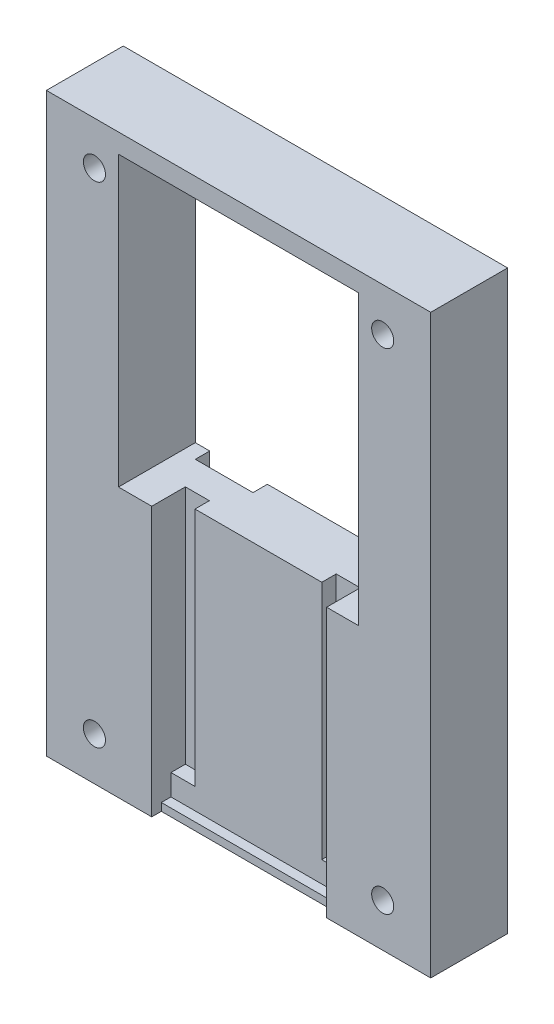
ISO-10303-21;
HEADER;
FILE_DESCRIPTION(('STEP AP214'),'2;1');
FILE_NAME('part.step','',(''),(''),'','','');
FILE_SCHEMA(('AUTOMOTIVE_DESIGN { 1 0 10303 214 1 1 1 1 }'));
ENDSEC;
DATA;
#1=APPLICATION_CONTEXT('core data for automotive mechanical design processes');
#2=APPLICATION_PROTOCOL_DEFINITION('international standard','automotive_design',2000,#1);
#3=PRODUCT_CONTEXT('',#1,'mechanical');
#4=PRODUCT('Part','Part','',(#3));
#5=PRODUCT_RELATED_PRODUCT_CATEGORY('part','',(#4));
#6=PRODUCT_DEFINITION_FORMATION('','',#4);
#7=PRODUCT_DEFINITION_CONTEXT('part definition',#1,'design');
#8=PRODUCT_DEFINITION('design','',#6,#7);
#9=PRODUCT_DEFINITION_SHAPE('','',#8);
#10=(LENGTH_UNIT() NAMED_UNIT(*) SI_UNIT(.MILLI.,.METRE.));
#11=(NAMED_UNIT(*) PLANE_ANGLE_UNIT() SI_UNIT($,.RADIAN.));
#12=(NAMED_UNIT(*) SI_UNIT($,.STERADIAN.) SOLID_ANGLE_UNIT());
#13=UNCERTAINTY_MEASURE_WITH_UNIT(LENGTH_MEASURE(1.E-05),#10,'distance_accuracy_value','');
#14=(GEOMETRIC_REPRESENTATION_CONTEXT(3) GLOBAL_UNCERTAINTY_ASSIGNED_CONTEXT((#13)) GLOBAL_UNIT_ASSIGNED_CONTEXT((#10,
#11,#12)) REPRESENTATION_CONTEXT('',''));
#15=CARTESIAN_POINT('',(0.,0.,0.));
#16=DIRECTION('',(0.,0.,1.));
#17=DIRECTION('',(1.,0.,0.));
#18=AXIS2_PLACEMENT_3D('',#15,#16,#17);
#19=CARTESIAN_POINT('',(0.,0.,0.));
#20=DIRECTION('',(0.,0.,1.));
#21=DIRECTION('',(1.,0.,0.));
#22=AXIS2_PLACEMENT_3D('',#19,#20,#21);
#23=PLANE('',#22);
#24=DIRECTION('',(1.,0.,0.));
#25=VECTOR('',#24,1.);
#26=CARTESIAN_POINT('',(26.,23.9,0.));
#27=LINE('',#26,#25);
#28=CARTESIAN_POINT('',(21.,23.9,0.));
#29=VERTEX_POINT('',#28);
#30=CARTESIAN_POINT('',(26.,23.9,0.));
#31=VERTEX_POINT('',#30);
#32=EDGE_CURVE('E251',#29,#31,#27,.T.);
#33=ORIENTED_EDGE('',*,*,#32,.F.);
#34=DIRECTION('',(0.,1.,0.));
#35=VECTOR('',#34,1.);
#36=CARTESIAN_POINT('',(21.,20.9,0.));
#37=LINE('',#36,#35);
#38=CARTESIAN_POINT('',(21.,20.9,0.));
#39=VERTEX_POINT('',#38);
#40=EDGE_CURVE('E53',#39,#29,#37,.T.);
#41=ORIENTED_EDGE('',*,*,#40,.F.);
#42=DIRECTION('',(-1.,0.,0.));
#43=VECTOR('',#42,1.);
#44=CARTESIAN_POINT('',(26.,20.9,0.));
#45=LINE('',#44,#43);
#46=CARTESIAN_POINT('',(26.,20.9,0.));
#47=VERTEX_POINT('',#46);
#48=EDGE_CURVE('E244',#47,#39,#45,.T.);
#49=ORIENTED_EDGE('',*,*,#48,.F.);
#50=DIRECTION('',(0.,-1.,0.));
#51=VECTOR('',#50,1.);
#52=CARTESIAN_POINT('',(26.,20.9,0.));
#53=LINE('',#52,#51);
#54=EDGE_CURVE('E247',#31,#47,#53,.T.);
#55=ORIENTED_EDGE('',*,*,#54,.F.);
#56=EDGE_LOOP('',(#33,#41,#49,#55));
#57=FACE_BOUND('',#56,.T.);
#58=DIRECTION('',(1.,0.,0.));
#59=VECTOR('',#58,1.);
#60=CARTESIAN_POINT('',(0.,0.,0.));
#61=LINE('',#60,#59);
#62=CARTESIAN_POINT('',(0.,0.,0.));
#63=VERTEX_POINT('',#62);
#64=CARTESIAN_POINT('',(40.,0.,0.));
#65=VERTEX_POINT('',#64);
#66=EDGE_CURVE('E419',#63,#65,#61,.T.);
#67=ORIENTED_EDGE('',*,*,#66,.F.);
#68=DIRECTION('',(0.,-1.,0.));
#69=VECTOR('',#68,1.);
#70=CARTESIAN_POINT('',(0.,0.,0.));
#71=LINE('',#70,#69);
#72=CARTESIAN_POINT('',(0.,60.,0.));
#73=VERTEX_POINT('',#72);
#74=EDGE_CURVE('E437',#73,#63,#71,.T.);
#75=ORIENTED_EDGE('',*,*,#74,.F.);
#76=DIRECTION('',(-1.,0.,0.));
#77=VECTOR('',#76,1.);
#78=CARTESIAN_POINT('',(0.,60.,0.));
#79=LINE('',#78,#77);
#80=CARTESIAN_POINT('',(40.,60.,0.));
#81=VERTEX_POINT('',#80);
#82=EDGE_CURVE('E440',#81,#73,#79,.T.);
#83=ORIENTED_EDGE('',*,*,#82,.F.);
#84=DIRECTION('',(0.,1.,0.));
#85=VECTOR('',#84,1.);
#86=CARTESIAN_POINT('',(40.,0.,0.));
#87=LINE('',#86,#85);
#88=EDGE_CURVE('E434',#65,#81,#87,.T.);
#89=ORIENTED_EDGE('',*,*,#88,.F.);
#90=EDGE_LOOP('',(#67,#75,#83,#89));
#91=FACE_BOUND('',#90,.T.);
#92=CARTESIAN_POINT('',(5.00000000000001,4.5,0.));
#93=DIRECTION('',(0.,0.,1.));
#94=DIRECTION('',(1.,0.,0.));
#95=AXIS2_PLACEMENT_3D('',#92,#93,#94);
#96=CIRCLE('',#95,1.15);
#97=CARTESIAN_POINT('',(6.15000000000001,4.5,0.));
#98=VERTEX_POINT('',#97);
#99=EDGE_CURVE('E417',#98,#98,#96,.T.);
#100=ORIENTED_EDGE('',*,*,#99,.T.);
#101=EDGE_LOOP('',(#100));
#102=FACE_BOUND('',#101,.T.);
#103=CARTESIAN_POINT('',(35.,55.5,0.));
#104=DIRECTION('',(0.,0.,1.));
#105=DIRECTION('',(1.,0.,0.));
#106=AXIS2_PLACEMENT_3D('',#103,#104,#105);
#107=CIRCLE('',#106,1.15);
#108=CARTESIAN_POINT('',(36.15,55.5,0.));
#109=VERTEX_POINT('',#108);
#110=EDGE_CURVE('E388',#109,#109,#107,.T.);
#111=ORIENTED_EDGE('',*,*,#110,.T.);
#112=EDGE_LOOP('',(#111));
#113=FACE_BOUND('',#112,.T.);
#114=CARTESIAN_POINT('',(5.00000000000001,55.5,0.));
#115=DIRECTION('',(0.,0.,1.));
#116=DIRECTION('',(1.,0.,0.));
#117=AXIS2_PLACEMENT_3D('',#114,#115,#116);
#118=CIRCLE('',#117,1.15);
#119=CARTESIAN_POINT('',(6.15000000000001,55.5,0.));
#120=VERTEX_POINT('',#119);
#121=EDGE_CURVE('E402',#120,#120,#118,.T.);
#122=ORIENTED_EDGE('',*,*,#121,.T.);
#123=EDGE_LOOP('',(#122));
#124=FACE_BOUND('',#123,.T.);
#125=CARTESIAN_POINT('',(35.,4.5,0.));
#126=DIRECTION('',(0.,0.,1.));
#127=DIRECTION('',(1.,0.,0.));
#128=AXIS2_PLACEMENT_3D('',#125,#126,#127);
#129=CIRCLE('',#128,1.15);
#130=CARTESIAN_POINT('',(36.15,4.5,0.));
#131=VERTEX_POINT('',#130);
#132=EDGE_CURVE('E409',#131,#131,#129,.T.);
#133=ORIENTED_EDGE('',*,*,#132,.T.);
#134=EDGE_LOOP('',(#133));
#135=FACE_BOUND('',#134,.T.);
#136=DIRECTION('',(0.,1.,0.));
#137=VECTOR('',#136,1.);
#138=CARTESIAN_POINT('',(9.,34.,0.));
#139=LINE('',#138,#137);
#140=CARTESIAN_POINT('',(9.,23.,0.));
#141=VERTEX_POINT('',#140);
#142=CARTESIAN_POINT('',(9.,28.,0.));
#143=VERTEX_POINT('',#142);
#144=EDGE_CURVE('E253',#141,#143,#139,.T.);
#145=ORIENTED_EDGE('',*,*,#144,.F.);
#146=DIRECTION('',(-1.,0.,0.));
#147=VECTOR('',#146,1.);
#148=CARTESIAN_POINT('',(9.,23.,0.));
#149=LINE('',#148,#147);
#150=CARTESIAN_POINT('',(15.,23.,0.));
#151=VERTEX_POINT('',#150);
#152=EDGE_CURVE('E272',#151,#141,#149,.T.);
#153=ORIENTED_EDGE('',*,*,#152,.F.);
#154=DIRECTION('',(0.,-1.,0.));
#155=VECTOR('',#154,1.);
#156=CARTESIAN_POINT('',(15.,34.,0.));
#157=LINE('',#156,#155);
#158=CARTESIAN_POINT('',(15.,28.,0.));
#159=VERTEX_POINT('',#158);
#160=EDGE_CURVE('E274',#159,#151,#157,.T.);
#161=ORIENTED_EDGE('',*,*,#160,.F.);
#162=DIRECTION('',(1.,0.,0.));
#163=VECTOR('',#162,1.);
#164=CARTESIAN_POINT('',(7.5,28.,0.));
#165=LINE('',#164,#163);
#166=CARTESIAN_POINT('',(32.5,28.,0.));
#167=VERTEX_POINT('',#166);
#168=EDGE_CURVE('E366',#159,#167,#165,.T.);
#169=ORIENTED_EDGE('',*,*,#168,.T.);
#170=DIRECTION('',(0.,1.,0.));
#171=VECTOR('',#170,1.);
#172=CARTESIAN_POINT('',(32.5,58.,0.));
#173=LINE('',#172,#171);
#174=CARTESIAN_POINT('',(32.5,58.,0.));
#175=VERTEX_POINT('',#174);
#176=EDGE_CURVE('E371',#167,#175,#173,.T.);
#177=ORIENTED_EDGE('',*,*,#176,.T.);
#178=DIRECTION('',(-1.,0.,0.));
#179=VECTOR('',#178,1.);
#180=CARTESIAN_POINT('',(7.5,58.,0.));
#181=LINE('',#180,#179);
#182=CARTESIAN_POINT('',(7.5,58.,0.));
#183=VERTEX_POINT('',#182);
#184=EDGE_CURVE('E372',#175,#183,#181,.T.);
#185=ORIENTED_EDGE('',*,*,#184,.T.);
#186=DIRECTION('',(0.,-1.,0.));
#187=VECTOR('',#186,1.);
#188=CARTESIAN_POINT('',(7.5,58.,0.));
#189=LINE('',#188,#187);
#190=CARTESIAN_POINT('',(7.5,28.,0.));
#191=VERTEX_POINT('',#190);
#192=EDGE_CURVE('E361',#183,#191,#189,.T.);
#193=ORIENTED_EDGE('',*,*,#192,.T.);
#194=EDGE_CURVE('E368',#191,#143,#165,.T.);
#195=ORIENTED_EDGE('',*,*,#194,.T.);
#196=EDGE_LOOP('',(#145,#153,#161,#169,#177,#185,#193,#195));
#197=FACE_BOUND('',#196,.T.);
#198=ADVANCED_FACE('F39',(#57,#91,#102,#113,#124,#135,#197),#23,.F.);
#199=CARTESIAN_POINT('',(0.,0.,6.));
#200=DIRECTION('',(0.,0.,-1.));
#201=DIRECTION('',(-1.,0.,0.));
#202=AXIS2_PLACEMENT_3D('',#199,#200,#201);
#203=PLANE('',#202);
#204=DIRECTION('',(-1.,0.,0.));
#205=VECTOR('',#204,1.);
#206=CARTESIAN_POINT('',(10.9625098567106,0.8,6.));
#207=LINE('',#206,#205);
#208=CARTESIAN_POINT('',(29.1625098567106,0.8,6.));
#209=VERTEX_POINT('',#208);
#210=CARTESIAN_POINT('',(10.9625098567106,0.8,6.));
#211=VERTEX_POINT('',#210);
#212=EDGE_CURVE('E262',#209,#211,#207,.T.);
#213=ORIENTED_EDGE('',*,*,#212,.F.);
#214=DIRECTION('',(0.,1.,0.));
#215=VECTOR('',#214,1.);
#216=CARTESIAN_POINT('',(29.1625098567106,0.,6.));
#217=LINE('',#216,#215);
#218=CARTESIAN_POINT('',(29.1625098567106,3.,6.));
#219=VERTEX_POINT('',#218);
#220=EDGE_CURVE('E355',#209,#219,#217,.T.);
#221=ORIENTED_EDGE('',*,*,#220,.T.);
#222=DIRECTION('',(1.,0.,0.));
#223=VECTOR('',#222,1.);
#224=CARTESIAN_POINT('',(29.1625098567106,3.,6.));
#225=LINE('',#224,#223);
#226=CARTESIAN_POINT('',(26.6625098567106,3.,6.));
#227=VERTEX_POINT('',#226);
#228=EDGE_CURVE('E333',#227,#219,#225,.T.);
#229=ORIENTED_EDGE('',*,*,#228,.F.);
#230=DIRECTION('',(0.,-1.,0.));
#231=VECTOR('',#230,1.);
#232=CARTESIAN_POINT('',(26.6625098567106,28.,6.));
#233=LINE('',#232,#231);
#234=CARTESIAN_POINT('',(26.6625098567106,28.,6.));
#235=VERTEX_POINT('',#234);
#236=EDGE_CURVE('E320',#235,#227,#233,.T.);
#237=ORIENTED_EDGE('',*,*,#236,.F.);
#238=DIRECTION('',(1.,0.,0.));
#239=VECTOR('',#238,1.);
#240=CARTESIAN_POINT('',(7.5,28.,6.));
#241=LINE('',#240,#239);
#242=CARTESIAN_POINT('',(13.4625098567106,28.,6.));
#243=VERTEX_POINT('',#242);
#244=EDGE_CURVE('E455',#243,#235,#241,.T.);
#245=ORIENTED_EDGE('',*,*,#244,.F.);
#246=DIRECTION('',(0.,1.,0.));
#247=VECTOR('',#246,1.);
#248=CARTESIAN_POINT('',(13.4625098567106,28.,6.));
#249=LINE('',#248,#247);
#250=CARTESIAN_POINT('',(13.4625098567106,3.,6.));
#251=VERTEX_POINT('',#250);
#252=EDGE_CURVE('E304',#251,#243,#249,.T.);
#253=ORIENTED_EDGE('',*,*,#252,.F.);
#254=DIRECTION('',(1.,0.,0.));
#255=VECTOR('',#254,1.);
#256=CARTESIAN_POINT('',(10.9625098567106,3.,6.));
#257=LINE('',#256,#255);
#258=CARTESIAN_POINT('',(10.9625098567106,3.,6.));
#259=VERTEX_POINT('',#258);
#260=EDGE_CURVE('E313',#259,#251,#257,.T.);
#261=ORIENTED_EDGE('',*,*,#260,.F.);
#262=DIRECTION('',(0.,-1.,0.));
#263=VECTOR('',#262,1.);
#264=CARTESIAN_POINT('',(10.9625098567106,0.,6.));
#265=LINE('',#264,#263);
#266=EDGE_CURVE('E346',#259,#211,#265,.T.);
#267=ORIENTED_EDGE('',*,*,#266,.T.);
#268=EDGE_LOOP('',(#213,#221,#229,#237,#245,#253,#261,#267));
#269=FACE_BOUND('',#268,.T.);
#270=ADVANCED_FACE('F493',(#269),#203,.F.);
#271=CARTESIAN_POINT('',(10.9625098567106,0.,6.));
#272=DIRECTION('',(-1.,0.,0.));
#273=DIRECTION('',(0.,0.,1.));
#274=AXIS2_PLACEMENT_3D('',#271,#272,#273);
#275=PLANE('',#274);
#276=DIRECTION('',(0.,-1.,0.));
#277=VECTOR('',#276,1.);
#278=CARTESIAN_POINT('',(10.9625098567106,0.,7.));
#279=LINE('',#278,#277);
#280=CARTESIAN_POINT('',(10.9625098567106,0.8,7.));
#281=VERTEX_POINT('',#280);
#282=CARTESIAN_POINT('',(10.9625098567106,0.,7.));
#283=VERTEX_POINT('',#282);
#284=EDGE_CURVE('E282',#281,#283,#279,.T.);
#285=ORIENTED_EDGE('',*,*,#284,.F.);
#286=DIRECTION('',(0.,0.,-1.));
#287=VECTOR('',#286,1.);
#288=CARTESIAN_POINT('',(10.9625098567106,0.8,7.));
#289=LINE('',#288,#287);
#290=EDGE_CURVE('E291',#281,#211,#289,.T.);
#291=ORIENTED_EDGE('',*,*,#290,.T.);
#292=ORIENTED_EDGE('',*,*,#266,.F.);
#293=DIRECTION('',(0.,0.,1.));
#294=VECTOR('',#293,1.);
#295=CARTESIAN_POINT('',(10.9625098567106,3.,4.5));
#296=LINE('',#295,#294);
#297=CARTESIAN_POINT('',(10.9625098567106,3.,4.5));
#298=VERTEX_POINT('',#297);
#299=EDGE_CURVE('E312',#298,#259,#296,.T.);
#300=ORIENTED_EDGE('',*,*,#299,.F.);
#301=DIRECTION('',(0.,-1.,0.));
#302=VECTOR('',#301,1.);
#303=CARTESIAN_POINT('',(10.9625098567106,28.,4.5));
#304=LINE('',#303,#302);
#305=CARTESIAN_POINT('',(10.9625098567106,28.,4.5));
#306=VERTEX_POINT('',#305);
#307=EDGE_CURVE('E301',#306,#298,#304,.T.);
#308=ORIENTED_EDGE('',*,*,#307,.F.);
#309=DIRECTION('',(0.,0.,-1.));
#310=VECTOR('',#309,1.);
#311=CARTESIAN_POINT('',(10.9625098567106,28.,0.));
#312=LINE('',#311,#310);
#313=CARTESIAN_POINT('',(10.9625098567106,28.,8.));
#314=VERTEX_POINT('',#313);
#315=EDGE_CURVE('E460',#314,#306,#312,.T.);
#316=ORIENTED_EDGE('',*,*,#315,.F.);
#317=DIRECTION('',(0.,-1.,0.));
#318=VECTOR('',#317,1.);
#319=CARTESIAN_POINT('',(10.9625098567106,0.,8.));
#320=LINE('',#319,#318);
#321=CARTESIAN_POINT('',(10.9625098567106,0.,8.));
#322=VERTEX_POINT('',#321);
#323=EDGE_CURVE('E325',#314,#322,#320,.T.);
#324=ORIENTED_EDGE('',*,*,#323,.T.);
#325=DIRECTION('',(0.,0.,1.));
#326=VECTOR('',#325,1.);
#327=CARTESIAN_POINT('',(10.9625098567106,0.,6.));
#328=LINE('',#327,#326);
#329=EDGE_CURVE('E351',#283,#322,#328,.T.);
#330=ORIENTED_EDGE('',*,*,#329,.F.);
#331=EDGE_LOOP('',(#285,#291,#292,#300,#308,#316,#324,#330));
#332=FACE_BOUND('',#331,.T.);
#333=ADVANCED_FACE('F497',(#332),#275,.F.);
#334=CARTESIAN_POINT('',(29.1625098567106,0.,6.));
#335=DIRECTION('',(1.,0.,0.));
#336=DIRECTION('',(0.,0.,-1.));
#337=AXIS2_PLACEMENT_3D('',#334,#335,#336);
#338=PLANE('',#337);
#339=DIRECTION('',(0.,0.,-1.));
#340=VECTOR('',#339,1.);
#341=CARTESIAN_POINT('',(29.1625098567106,0.8,7.));
#342=LINE('',#341,#340);
#343=CARTESIAN_POINT('',(29.1625098567106,0.8,7.));
#344=VERTEX_POINT('',#343);
#345=EDGE_CURVE('E300',#344,#209,#342,.T.);
#346=ORIENTED_EDGE('',*,*,#345,.F.);
#347=DIRECTION('',(0.,1.,0.));
#348=VECTOR('',#347,1.);
#349=CARTESIAN_POINT('',(29.1625098567106,0.,7.));
#350=LINE('',#349,#348);
#351=CARTESIAN_POINT('',(29.1625098567106,0.,7.));
#352=VERTEX_POINT('',#351);
#353=EDGE_CURVE('E290',#352,#344,#350,.T.);
#354=ORIENTED_EDGE('',*,*,#353,.F.);
#355=DIRECTION('',(0.,0.,1.));
#356=VECTOR('',#355,1.);
#357=CARTESIAN_POINT('',(29.1625098567106,0.,6.));
#358=LINE('',#357,#356);
#359=CARTESIAN_POINT('',(29.1625098567106,0.,8.));
#360=VERTEX_POINT('',#359);
#361=EDGE_CURVE('E360',#352,#360,#358,.T.);
#362=ORIENTED_EDGE('',*,*,#361,.T.);
#363=DIRECTION('',(0.,1.,0.));
#364=VECTOR('',#363,1.);
#365=CARTESIAN_POINT('',(29.1625098567106,0.,8.));
#366=LINE('',#365,#364);
#367=CARTESIAN_POINT('',(29.1625098567106,28.,8.));
#368=VERTEX_POINT('',#367);
#369=EDGE_CURVE('E353',#360,#368,#366,.T.);
#370=ORIENTED_EDGE('',*,*,#369,.T.);
#371=DIRECTION('',(0.,0.,1.));
#372=VECTOR('',#371,1.);
#373=CARTESIAN_POINT('',(29.1625098567106,28.,0.));
#374=LINE('',#373,#372);
#375=CARTESIAN_POINT('',(29.1625098567106,28.,4.5));
#376=VERTEX_POINT('',#375);
#377=EDGE_CURVE('E453',#376,#368,#374,.T.);
#378=ORIENTED_EDGE('',*,*,#377,.F.);
#379=DIRECTION('',(0.,1.,0.));
#380=VECTOR('',#379,1.);
#381=CARTESIAN_POINT('',(29.1625098567106,28.,4.5));
#382=LINE('',#381,#380);
#383=CARTESIAN_POINT('',(29.1625098567106,3.,4.5));
#384=VERTEX_POINT('',#383);
#385=EDGE_CURVE('E337',#384,#376,#382,.T.);
#386=ORIENTED_EDGE('',*,*,#385,.F.);
#387=DIRECTION('',(0.,0.,1.));
#388=VECTOR('',#387,1.);
#389=CARTESIAN_POINT('',(29.1625098567106,3.,4.5));
#390=LINE('',#389,#388);
#391=EDGE_CURVE('E297',#384,#219,#390,.T.);
#392=ORIENTED_EDGE('',*,*,#391,.T.);
#393=ORIENTED_EDGE('',*,*,#220,.F.);
#394=EDGE_LOOP('',(#346,#354,#362,#370,#378,#386,#392,#393));
#395=FACE_BOUND('',#394,.T.);
#396=ADVANCED_FACE('F518',(#395),#338,.F.);
#397=CARTESIAN_POINT('',(0.,0.,8.));
#398=DIRECTION('',(0.,1.,0.));
#399=DIRECTION('',(-1.,0.,0.));
#400=AXIS2_PLACEMENT_3D('',#397,#398,#399);
#401=PLANE('',#400);
#402=DIRECTION('',(1.,0.,0.));
#403=VECTOR('',#402,1.);
#404=CARTESIAN_POINT('',(10.9625098567106,0.,7.));
#405=LINE('',#404,#403);
#406=EDGE_CURVE('E281',#283,#352,#405,.T.);
#407=ORIENTED_EDGE('',*,*,#406,.F.);
#408=ORIENTED_EDGE('',*,*,#329,.T.);
#409=DIRECTION('',(1.,0.,0.));
#410=VECTOR('',#409,1.);
#411=CARTESIAN_POINT('',(0.,0.,8.));
#412=LINE('',#411,#410);
#413=CARTESIAN_POINT('',(0.,0.,8.));
#414=VERTEX_POINT('',#413);
#415=EDGE_CURVE('E422',#414,#322,#412,.T.);
#416=ORIENTED_EDGE('',*,*,#415,.F.);
#417=DIRECTION('',(0.,0.,-1.));
#418=VECTOR('',#417,1.);
#419=CARTESIAN_POINT('',(0.,0.,8.));
#420=LINE('',#419,#418);
#421=EDGE_CURVE('E435',#414,#63,#420,.T.);
#422=ORIENTED_EDGE('',*,*,#421,.T.);
#423=ORIENTED_EDGE('',*,*,#66,.T.);
#424=DIRECTION('',(0.,0.,-1.));
#425=VECTOR('',#424,1.);
#426=CARTESIAN_POINT('',(40.,0.,8.));
#427=LINE('',#426,#425);
#428=CARTESIAN_POINT('',(40.,0.,8.));
#429=VERTEX_POINT('',#428);
#430=EDGE_CURVE('E446',#429,#65,#427,.T.);
#431=ORIENTED_EDGE('',*,*,#430,.F.);
#432=EDGE_CURVE('E428',#360,#429,#412,.T.);
#433=ORIENTED_EDGE('',*,*,#432,.F.);
#434=ORIENTED_EDGE('',*,*,#361,.F.);
#435=EDGE_LOOP('',(#407,#408,#416,#422,#423,#431,#433,#434));
#436=FACE_BOUND('',#435,.T.);
#437=ADVANCED_FACE('F41',(#436),#401,.F.);
#438=CARTESIAN_POINT('',(40.,0.,8.));
#439=DIRECTION('',(-1.,0.,0.));
#440=DIRECTION('',(0.,0.,1.));
#441=AXIS2_PLACEMENT_3D('',#438,#439,#440);
#442=PLANE('',#441);
#443=ORIENTED_EDGE('',*,*,#88,.T.);
#444=DIRECTION('',(0.,0.,-1.));
#445=VECTOR('',#444,1.);
#446=CARTESIAN_POINT('',(40.,60.,8.));
#447=LINE('',#446,#445);
#448=CARTESIAN_POINT('',(40.,60.,8.));
#449=VERTEX_POINT('',#448);
#450=EDGE_CURVE('E447',#449,#81,#447,.T.);
#451=ORIENTED_EDGE('',*,*,#450,.F.);
#452=DIRECTION('',(0.,1.,0.));
#453=VECTOR('',#452,1.);
#454=CARTESIAN_POINT('',(40.,0.,8.));
#455=LINE('',#454,#453);
#456=EDGE_CURVE('E424',#429,#449,#455,.T.);
#457=ORIENTED_EDGE('',*,*,#456,.F.);
#458=ORIENTED_EDGE('',*,*,#430,.T.);
#459=EDGE_LOOP('',(#443,#451,#457,#458));
#460=FACE_BOUND('',#459,.T.);
#461=ADVANCED_FACE('F514',(#460),#442,.F.);
#462=CARTESIAN_POINT('',(0.,60.,8.));
#463=DIRECTION('',(0.,-1.,0.));
#464=DIRECTION('',(1.,0.,0.));
#465=AXIS2_PLACEMENT_3D('',#462,#463,#464);
#466=PLANE('',#465);
#467=ORIENTED_EDGE('',*,*,#82,.T.);
#468=DIRECTION('',(0.,0.,-1.));
#469=VECTOR('',#468,1.);
#470=CARTESIAN_POINT('',(0.,60.,8.));
#471=LINE('',#470,#469);
#472=CARTESIAN_POINT('',(0.,60.,8.));
#473=VERTEX_POINT('',#472);
#474=EDGE_CURVE('E442',#473,#73,#471,.T.);
#475=ORIENTED_EDGE('',*,*,#474,.F.);
#476=DIRECTION('',(-1.,0.,0.));
#477=VECTOR('',#476,1.);
#478=CARTESIAN_POINT('',(0.,60.,8.));
#479=LINE('',#478,#477);
#480=EDGE_CURVE('E426',#449,#473,#479,.T.);
#481=ORIENTED_EDGE('',*,*,#480,.F.);
#482=ORIENTED_EDGE('',*,*,#450,.T.);
#483=EDGE_LOOP('',(#467,#475,#481,#482));
#484=FACE_BOUND('',#483,.T.);
#485=ADVANCED_FACE('F509',(#484),#466,.F.);
#486=CARTESIAN_POINT('',(0.,0.,8.));
#487=DIRECTION('',(1.,0.,0.));
#488=DIRECTION('',(0.,0.,-1.));
#489=AXIS2_PLACEMENT_3D('',#486,#487,#488);
#490=PLANE('',#489);
#491=ORIENTED_EDGE('',*,*,#74,.T.);
#492=ORIENTED_EDGE('',*,*,#421,.F.);
#493=DIRECTION('',(0.,-1.,0.));
#494=VECTOR('',#493,1.);
#495=CARTESIAN_POINT('',(0.,0.,8.));
#496=LINE('',#495,#494);
#497=EDGE_CURVE('E427',#473,#414,#496,.T.);
#498=ORIENTED_EDGE('',*,*,#497,.F.);
#499=ORIENTED_EDGE('',*,*,#474,.T.);
#500=EDGE_LOOP('',(#491,#492,#498,#499));
#501=FACE_BOUND('',#500,.T.);
#502=ADVANCED_FACE('F510',(#501),#490,.F.);
#503=CARTESIAN_POINT('',(0.,0.,8.));
#504=DIRECTION('',(0.,0.,1.));
#505=DIRECTION('',(1.,0.,0.));
#506=AXIS2_PLACEMENT_3D('',#503,#504,#505);
#507=PLANE('',#506);
#508=ORIENTED_EDGE('',*,*,#323,.F.);
#509=DIRECTION('',(1.,0.,0.));
#510=VECTOR('',#509,1.);
#511=CARTESIAN_POINT('',(7.5,28.,8.));
#512=LINE('',#511,#510);
#513=CARTESIAN_POINT('',(7.5,28.,8.));
#514=VERTEX_POINT('',#513);
#515=EDGE_CURVE('E379',#514,#314,#512,.T.);
#516=ORIENTED_EDGE('',*,*,#515,.F.);
#517=DIRECTION('',(0.,-1.,0.));
#518=VECTOR('',#517,1.);
#519=CARTESIAN_POINT('',(7.5,58.,8.));
#520=LINE('',#519,#518);
#521=CARTESIAN_POINT('',(7.5,58.,8.));
#522=VERTEX_POINT('',#521);
#523=EDGE_CURVE('E363',#522,#514,#520,.T.);
#524=ORIENTED_EDGE('',*,*,#523,.F.);
#525=DIRECTION('',(-1.,0.,0.));
#526=VECTOR('',#525,1.);
#527=CARTESIAN_POINT('',(7.5,58.,8.));
#528=LINE('',#527,#526);
#529=CARTESIAN_POINT('',(32.5,58.,8.));
#530=VERTEX_POINT('',#529);
#531=EDGE_CURVE('E370',#530,#522,#528,.T.);
#532=ORIENTED_EDGE('',*,*,#531,.F.);
#533=DIRECTION('',(0.,1.,0.));
#534=VECTOR('',#533,1.);
#535=CARTESIAN_POINT('',(32.5,58.,8.));
#536=LINE('',#535,#534);
#537=CARTESIAN_POINT('',(32.5,28.,8.));
#538=VERTEX_POINT('',#537);
#539=EDGE_CURVE('E384',#538,#530,#536,.T.);
#540=ORIENTED_EDGE('',*,*,#539,.F.);
#541=EDGE_CURVE('E378',#368,#538,#512,.T.);
#542=ORIENTED_EDGE('',*,*,#541,.F.);
#543=ORIENTED_EDGE('',*,*,#369,.F.);
#544=ORIENTED_EDGE('',*,*,#432,.T.);
#545=ORIENTED_EDGE('',*,*,#456,.T.);
#546=ORIENTED_EDGE('',*,*,#480,.T.);
#547=ORIENTED_EDGE('',*,*,#497,.T.);
#548=ORIENTED_EDGE('',*,*,#415,.T.);
#549=EDGE_LOOP('',(#508,#516,#524,#532,#540,#542,#543,#544,#545,#546,#547,#548));
#550=FACE_BOUND('',#549,.T.);
#551=CARTESIAN_POINT('',(35.,4.5,8.));
#552=DIRECTION('',(0.,0.,1.));
#553=DIRECTION('',(1.,0.,0.));
#554=AXIS2_PLACEMENT_3D('',#551,#552,#553);
#555=CIRCLE('',#554,1.15);
#556=CARTESIAN_POINT('',(36.15,4.5,8.));
#557=VERTEX_POINT('',#556);
#558=EDGE_CURVE('E404',#557,#557,#555,.T.);
#559=ORIENTED_EDGE('',*,*,#558,.F.);
#560=EDGE_LOOP('',(#559));
#561=FACE_BOUND('',#560,.T.);
#562=CARTESIAN_POINT('',(5.00000000000001,55.5,8.));
#563=DIRECTION('',(0.,0.,1.));
#564=DIRECTION('',(1.,0.,0.));
#565=AXIS2_PLACEMENT_3D('',#562,#563,#564);
#566=CIRCLE('',#565,1.15);
#567=CARTESIAN_POINT('',(6.15000000000001,55.5,8.));
#568=VERTEX_POINT('',#567);
#569=EDGE_CURVE('E412',#568,#568,#566,.T.);
#570=ORIENTED_EDGE('',*,*,#569,.F.);
#571=EDGE_LOOP('',(#570));
#572=FACE_BOUND('',#571,.T.);
#573=CARTESIAN_POINT('',(35.,55.5,8.));
#574=DIRECTION('',(0.,0.,1.));
#575=DIRECTION('',(1.,0.,0.));
#576=AXIS2_PLACEMENT_3D('',#573,#574,#575);
#577=CIRCLE('',#576,1.15);
#578=CARTESIAN_POINT('',(36.15,55.5,8.));
#579=VERTEX_POINT('',#578);
#580=EDGE_CURVE('E398',#579,#579,#577,.T.);
#581=ORIENTED_EDGE('',*,*,#580,.F.);
#582=EDGE_LOOP('',(#581));
#583=FACE_BOUND('',#582,.T.);
#584=CARTESIAN_POINT('',(5.00000000000001,4.5,8.));
#585=DIRECTION('',(0.,0.,1.));
#586=DIRECTION('',(1.,0.,0.));
#587=AXIS2_PLACEMENT_3D('',#584,#585,#586);
#588=CIRCLE('',#587,1.15);
#589=CARTESIAN_POINT('',(6.15000000000001,4.5,8.));
#590=VERTEX_POINT('',#589);
#591=EDGE_CURVE('E410',#590,#590,#588,.T.);
#592=ORIENTED_EDGE('',*,*,#591,.F.);
#593=EDGE_LOOP('',(#592));
#594=FACE_BOUND('',#593,.T.);
#595=ADVANCED_FACE('F504',(#550,#561,#572,#583,#594),#507,.T.);
#596=CARTESIAN_POINT('',(5.00000000000001,4.5,0.));
#597=DIRECTION('',(0.,0.,1.));
#598=DIRECTION('',(1.,0.,0.));
#599=AXIS2_PLACEMENT_3D('',#596,#597,#598);
#600=CYLINDRICAL_SURFACE('',#599,1.15);
#601=ORIENTED_EDGE('',*,*,#99,.F.);
#602=EDGE_LOOP('',(#601));
#603=FACE_BOUND('',#602,.T.);
#604=ORIENTED_EDGE('',*,*,#591,.T.);
#605=EDGE_LOOP('',(#604));
#606=FACE_BOUND('',#605,.T.);
#607=ADVANCED_FACE('F616',(#603,#606),#600,.F.);
#608=CARTESIAN_POINT('',(35.,55.5,0.));
#609=DIRECTION('',(0.,0.,1.));
#610=DIRECTION('',(1.,0.,0.));
#611=AXIS2_PLACEMENT_3D('',#608,#609,#610);
#612=CYLINDRICAL_SURFACE('',#611,1.15);
#613=ORIENTED_EDGE('',*,*,#110,.F.);
#614=EDGE_LOOP('',(#613));
#615=FACE_BOUND('',#614,.T.);
#616=ORIENTED_EDGE('',*,*,#580,.T.);
#617=EDGE_LOOP('',(#616));
#618=FACE_BOUND('',#617,.T.);
#619=ADVANCED_FACE('F614',(#615,#618),#612,.F.);
#620=CARTESIAN_POINT('',(5.00000000000001,55.5,0.));
#621=DIRECTION('',(0.,0.,1.));
#622=DIRECTION('',(1.,0.,0.));
#623=AXIS2_PLACEMENT_3D('',#620,#621,#622);
#624=CYLINDRICAL_SURFACE('',#623,1.15);
#625=ORIENTED_EDGE('',*,*,#121,.F.);
#626=EDGE_LOOP('',(#625));
#627=FACE_BOUND('',#626,.T.);
#628=ORIENTED_EDGE('',*,*,#569,.T.);
#629=EDGE_LOOP('',(#628));
#630=FACE_BOUND('',#629,.T.);
#631=ADVANCED_FACE('F617',(#627,#630),#624,.F.);
#632=CARTESIAN_POINT('',(35.,4.5,0.));
#633=DIRECTION('',(0.,0.,1.));
#634=DIRECTION('',(1.,0.,0.));
#635=AXIS2_PLACEMENT_3D('',#632,#633,#634);
#636=CYLINDRICAL_SURFACE('',#635,1.15);
#637=ORIENTED_EDGE('',*,*,#132,.F.);
#638=EDGE_LOOP('',(#637));
#639=FACE_BOUND('',#638,.T.);
#640=ORIENTED_EDGE('',*,*,#558,.T.);
#641=EDGE_LOOP('',(#640));
#642=FACE_BOUND('',#641,.T.);
#643=ADVANCED_FACE('F613',(#639,#642),#636,.F.);
#644=CARTESIAN_POINT('',(7.5,58.,0.));
#645=DIRECTION('',(-1.,0.,0.));
#646=DIRECTION('',(0.,-1.,0.));
#647=AXIS2_PLACEMENT_3D('',#644,#645,#646);
#648=PLANE('',#647);
#649=ORIENTED_EDGE('',*,*,#523,.T.);
#650=DIRECTION('',(0.,0.,1.));
#651=VECTOR('',#650,1.);
#652=CARTESIAN_POINT('',(7.5,28.,0.));
#653=LINE('',#652,#651);
#654=EDGE_CURVE('E380',#191,#514,#653,.T.);
#655=ORIENTED_EDGE('',*,*,#654,.F.);
#656=ORIENTED_EDGE('',*,*,#192,.F.);
#657=DIRECTION('',(0.,0.,1.));
#658=VECTOR('',#657,1.);
#659=CARTESIAN_POINT('',(7.5,58.,0.));
#660=LINE('',#659,#658);
#661=EDGE_CURVE('E389',#183,#522,#660,.T.);
#662=ORIENTED_EDGE('',*,*,#661,.T.);
#663=EDGE_LOOP('',(#649,#655,#656,#662));
#664=FACE_BOUND('',#663,.T.);
#665=ADVANCED_FACE('F558',(#664),#648,.F.);
#666=CARTESIAN_POINT('',(7.5,58.,0.));
#667=DIRECTION('',(0.,1.,0.));
#668=DIRECTION('',(0.,0.,1.));
#669=AXIS2_PLACEMENT_3D('',#666,#667,#668);
#670=PLANE('',#669);
#671=ORIENTED_EDGE('',*,*,#531,.T.);
#672=ORIENTED_EDGE('',*,*,#661,.F.);
#673=ORIENTED_EDGE('',*,*,#184,.F.);
#674=DIRECTION('',(0.,0.,1.));
#675=VECTOR('',#674,1.);
#676=CARTESIAN_POINT('',(32.5,58.,0.));
#677=LINE('',#676,#675);
#678=EDGE_CURVE('E392',#175,#530,#677,.T.);
#679=ORIENTED_EDGE('',*,*,#678,.T.);
#680=EDGE_LOOP('',(#671,#672,#673,#679));
#681=FACE_BOUND('',#680,.T.);
#682=ADVANCED_FACE('F557',(#681),#670,.F.);
#683=CARTESIAN_POINT('',(32.5,58.,0.));
#684=DIRECTION('',(1.,0.,0.));
#685=DIRECTION('',(0.,0.,-1.));
#686=AXIS2_PLACEMENT_3D('',#683,#684,#685);
#687=PLANE('',#686);
#688=ORIENTED_EDGE('',*,*,#539,.T.);
#689=ORIENTED_EDGE('',*,*,#678,.F.);
#690=ORIENTED_EDGE('',*,*,#176,.F.);
#691=DIRECTION('',(0.,0.,1.));
#692=VECTOR('',#691,1.);
#693=CARTESIAN_POINT('',(32.5,28.,0.));
#694=LINE('',#693,#692);
#695=EDGE_CURVE('E395',#167,#538,#694,.T.);
#696=ORIENTED_EDGE('',*,*,#695,.T.);
#697=EDGE_LOOP('',(#688,#689,#690,#696));
#698=FACE_BOUND('',#697,.T.);
#699=ADVANCED_FACE('F565',(#698),#687,.F.);
#700=CARTESIAN_POINT('',(7.5,28.,0.));
#701=DIRECTION('',(0.,-1.,0.));
#702=DIRECTION('',(1.,0.,0.));
#703=AXIS2_PLACEMENT_3D('',#700,#701,#702);
#704=PLANE('',#703);
#705=DIRECTION('',(-1.,0.,0.));
#706=VECTOR('',#705,1.);
#707=CARTESIAN_POINT('',(7.5,28.,1.5));
#708=LINE('',#707,#706);
#709=CARTESIAN_POINT('',(15.,28.,1.5));
#710=VERTEX_POINT('',#709);
#711=CARTESIAN_POINT('',(9.,28.,1.5));
#712=VERTEX_POINT('',#711);
#713=EDGE_CURVE('E458',#710,#712,#708,.T.);
#714=ORIENTED_EDGE('',*,*,#713,.T.);
#715=DIRECTION('',(0.,0.,-1.));
#716=VECTOR('',#715,1.);
#717=CARTESIAN_POINT('',(9.,28.,0.));
#718=LINE('',#717,#716);
#719=EDGE_CURVE('E11',#712,#143,#718,.T.);
#720=ORIENTED_EDGE('',*,*,#719,.T.);
#721=ORIENTED_EDGE('',*,*,#194,.F.);
#722=ORIENTED_EDGE('',*,*,#654,.T.);
#723=ORIENTED_EDGE('',*,*,#515,.T.);
#724=ORIENTED_EDGE('',*,*,#315,.T.);
#725=DIRECTION('',(-1.,0.,0.));
#726=VECTOR('',#725,1.);
#727=CARTESIAN_POINT('',(10.9625098567106,28.,4.5));
#728=LINE('',#727,#726);
#729=CARTESIAN_POINT('',(13.4625098567106,28.,4.5));
#730=VERTEX_POINT('',#729);
#731=EDGE_CURVE('E309',#730,#306,#728,.T.);
#732=ORIENTED_EDGE('',*,*,#731,.F.);
#733=DIRECTION('',(0.,0.,1.));
#734=VECTOR('',#733,1.);
#735=CARTESIAN_POINT('',(13.4625098567106,28.,4.5));
#736=LINE('',#735,#734);
#737=EDGE_CURVE('E316',#730,#243,#736,.T.);
#738=ORIENTED_EDGE('',*,*,#737,.T.);
#739=ORIENTED_EDGE('',*,*,#244,.T.);
#740=DIRECTION('',(0.,0.,1.));
#741=VECTOR('',#740,1.);
#742=CARTESIAN_POINT('',(26.6625098567106,28.,4.5));
#743=LINE('',#742,#741);
#744=CARTESIAN_POINT('',(26.6625098567106,28.,4.5));
#745=VERTEX_POINT('',#744);
#746=EDGE_CURVE('E327',#745,#235,#743,.T.);
#747=ORIENTED_EDGE('',*,*,#746,.F.);
#748=DIRECTION('',(-1.,0.,0.));
#749=VECTOR('',#748,1.);
#750=CARTESIAN_POINT('',(29.1625098567106,28.,4.5));
#751=LINE('',#750,#749);
#752=EDGE_CURVE('E341',#376,#745,#751,.T.);
#753=ORIENTED_EDGE('',*,*,#752,.F.);
#754=ORIENTED_EDGE('',*,*,#377,.T.);
#755=ORIENTED_EDGE('',*,*,#541,.T.);
#756=ORIENTED_EDGE('',*,*,#695,.F.);
#757=ORIENTED_EDGE('',*,*,#168,.F.);
#758=DIRECTION('',(0.,0.,1.));
#759=VECTOR('',#758,1.);
#760=CARTESIAN_POINT('',(15.,28.,0.));
#761=LINE('',#760,#759);
#762=EDGE_CURVE('E50',#159,#710,#761,.T.);
#763=ORIENTED_EDGE('',*,*,#762,.T.);
#764=EDGE_LOOP('',(#714,#720,#721,#722,#723,#724,#732,#738,#739,#747,#753,#754,#755,#756,#757,#763));
#765=FACE_BOUND('',#764,.T.);
#766=ADVANCED_FACE('F461',(#765),#704,.F.);
#767=CARTESIAN_POINT('',(29.1625098567106,3.,4.5));
#768=DIRECTION('',(0.,-1.,0.));
#769=DIRECTION('',(1.,0.,0.));
#770=AXIS2_PLACEMENT_3D('',#767,#768,#769);
#771=PLANE('',#770);
#772=ORIENTED_EDGE('',*,*,#228,.T.);
#773=ORIENTED_EDGE('',*,*,#391,.F.);
#774=DIRECTION('',(1.,0.,0.));
#775=VECTOR('',#774,1.);
#776=CARTESIAN_POINT('',(29.1625098567106,3.,4.5));
#777=LINE('',#776,#775);
#778=CARTESIAN_POINT('',(26.6625098567106,3.,4.5));
#779=VERTEX_POINT('',#778);
#780=EDGE_CURVE('E330',#779,#384,#777,.T.);
#781=ORIENTED_EDGE('',*,*,#780,.F.);
#782=DIRECTION('',(0.,0.,1.));
#783=VECTOR('',#782,1.);
#784=CARTESIAN_POINT('',(26.6625098567106,3.,4.5));
#785=LINE('',#784,#783);
#786=EDGE_CURVE('E326',#779,#227,#785,.T.);
#787=ORIENTED_EDGE('',*,*,#786,.T.);
#788=EDGE_LOOP('',(#772,#773,#781,#787));
#789=FACE_BOUND('',#788,.T.);
#790=ADVANCED_FACE('F571',(#789),#771,.F.);
#791=CARTESIAN_POINT('',(26.6625098567106,28.,4.5));
#792=DIRECTION('',(-1.,0.,0.));
#793=DIRECTION('',(0.,-1.,0.));
#794=AXIS2_PLACEMENT_3D('',#791,#792,#793);
#795=PLANE('',#794);
#796=ORIENTED_EDGE('',*,*,#236,.T.);
#797=ORIENTED_EDGE('',*,*,#786,.F.);
#798=DIRECTION('',(0.,-1.,0.));
#799=VECTOR('',#798,1.);
#800=CARTESIAN_POINT('',(26.6625098567106,28.,4.5));
#801=LINE('',#800,#799);
#802=EDGE_CURVE('E342',#745,#779,#801,.T.);
#803=ORIENTED_EDGE('',*,*,#802,.F.);
#804=ORIENTED_EDGE('',*,*,#746,.T.);
#805=EDGE_LOOP('',(#796,#797,#803,#804));
#806=FACE_BOUND('',#805,.T.);
#807=ADVANCED_FACE('F588',(#806),#795,.F.);
#808=CARTESIAN_POINT('',(0.,0.,4.5));
#809=DIRECTION('',(0.,0.,-1.));
#810=DIRECTION('',(-1.,0.,0.));
#811=AXIS2_PLACEMENT_3D('',#808,#809,#810);
#812=PLANE('',#811);
#813=ORIENTED_EDGE('',*,*,#385,.T.);
#814=ORIENTED_EDGE('',*,*,#752,.T.);
#815=ORIENTED_EDGE('',*,*,#802,.T.);
#816=ORIENTED_EDGE('',*,*,#780,.T.);
#817=EDGE_LOOP('',(#813,#814,#815,#816));
#818=FACE_BOUND('',#817,.T.);
#819=ADVANCED_FACE('F568',(#818),#812,.F.);
#820=CARTESIAN_POINT('',(13.4625098567106,28.,4.5));
#821=DIRECTION('',(1.,0.,0.));
#822=DIRECTION('',(0.,1.,0.));
#823=AXIS2_PLACEMENT_3D('',#820,#821,#822);
#824=PLANE('',#823);
#825=ORIENTED_EDGE('',*,*,#252,.T.);
#826=ORIENTED_EDGE('',*,*,#737,.F.);
#827=DIRECTION('',(0.,1.,0.));
#828=VECTOR('',#827,1.);
#829=CARTESIAN_POINT('',(13.4625098567106,28.,4.5));
#830=LINE('',#829,#828);
#831=CARTESIAN_POINT('',(13.4625098567106,3.,4.5));
#832=VERTEX_POINT('',#831);
#833=EDGE_CURVE('E308',#832,#730,#830,.T.);
#834=ORIENTED_EDGE('',*,*,#833,.F.);
#835=DIRECTION('',(0.,0.,1.));
#836=VECTOR('',#835,1.);
#837=CARTESIAN_POINT('',(13.4625098567106,3.,4.5));
#838=LINE('',#837,#836);
#839=EDGE_CURVE('E324',#832,#251,#838,.T.);
#840=ORIENTED_EDGE('',*,*,#839,.T.);
#841=EDGE_LOOP('',(#825,#826,#834,#840));
#842=FACE_BOUND('',#841,.T.);
#843=ADVANCED_FACE('F587',(#842),#824,.F.);
#844=CARTESIAN_POINT('',(10.9625098567106,3.,4.5));
#845=DIRECTION('',(0.,-1.,0.));
#846=DIRECTION('',(0.,0.,-1.));
#847=AXIS2_PLACEMENT_3D('',#844,#845,#846);
#848=PLANE('',#847);
#849=ORIENTED_EDGE('',*,*,#260,.T.);
#850=ORIENTED_EDGE('',*,*,#839,.F.);
#851=DIRECTION('',(1.,0.,0.));
#852=VECTOR('',#851,1.);
#853=CARTESIAN_POINT('',(10.9625098567106,3.,4.5));
#854=LINE('',#853,#852);
#855=EDGE_CURVE('E302',#298,#832,#854,.T.);
#856=ORIENTED_EDGE('',*,*,#855,.F.);
#857=ORIENTED_EDGE('',*,*,#299,.T.);
#858=EDGE_LOOP('',(#849,#850,#856,#857));
#859=FACE_BOUND('',#858,.T.);
#860=ADVANCED_FACE('F578',(#859),#848,.F.);
#861=CARTESIAN_POINT('',(0.,0.,4.5));
#862=DIRECTION('',(0.,0.,1.));
#863=DIRECTION('',(1.,0.,0.));
#864=AXIS2_PLACEMENT_3D('',#861,#862,#863);
#865=PLANE('',#864);
#866=ORIENTED_EDGE('',*,*,#307,.T.);
#867=ORIENTED_EDGE('',*,*,#855,.T.);
#868=ORIENTED_EDGE('',*,*,#833,.T.);
#869=ORIENTED_EDGE('',*,*,#731,.T.);
#870=EDGE_LOOP('',(#866,#867,#868,#869));
#871=FACE_BOUND('',#870,.T.);
#872=ADVANCED_FACE('F584',(#871),#865,.T.);
#873=CARTESIAN_POINT('',(10.9625098567106,0.8,7.));
#874=DIRECTION('',(0.,-1.,0.));
#875=DIRECTION('',(0.,0.,-1.));
#876=AXIS2_PLACEMENT_3D('',#873,#874,#875);
#877=PLANE('',#876);
#878=ORIENTED_EDGE('',*,*,#212,.T.);
#879=ORIENTED_EDGE('',*,*,#290,.F.);
#880=DIRECTION('',(-1.,0.,0.));
#881=VECTOR('',#880,1.);
#882=CARTESIAN_POINT('',(10.9625098567106,0.8,7.));
#883=LINE('',#882,#881);
#884=EDGE_CURVE('E286',#344,#281,#883,.T.);
#885=ORIENTED_EDGE('',*,*,#884,.F.);
#886=ORIENTED_EDGE('',*,*,#345,.T.);
#887=EDGE_LOOP('',(#878,#879,#885,#886));
#888=FACE_BOUND('',#887,.T.);
#889=ADVANCED_FACE('F574',(#888),#877,.F.);
#890=CARTESIAN_POINT('',(0.,0.,7.));
#891=DIRECTION('',(0.,0.,-1.));
#892=DIRECTION('',(-1.,0.,0.));
#893=AXIS2_PLACEMENT_3D('',#890,#891,#892);
#894=PLANE('',#893);
#895=ORIENTED_EDGE('',*,*,#284,.T.);
#896=ORIENTED_EDGE('',*,*,#406,.T.);
#897=ORIENTED_EDGE('',*,*,#353,.T.);
#898=ORIENTED_EDGE('',*,*,#884,.T.);
#899=EDGE_LOOP('',(#895,#896,#897,#898));
#900=FACE_BOUND('',#899,.T.);
#901=ADVANCED_FACE('F541',(#900),#894,.F.);
#902=CARTESIAN_POINT('',(9.,34.,1.5));
#903=DIRECTION('',(-1.,0.,0.));
#904=DIRECTION('',(0.,0.,1.));
#905=AXIS2_PLACEMENT_3D('',#902,#903,#904);
#906=PLANE('',#905);
#907=DIRECTION('',(0.,1.,0.));
#908=VECTOR('',#907,1.);
#909=CARTESIAN_POINT('',(9.,34.,1.5));
#910=LINE('',#909,#908);
#911=CARTESIAN_POINT('',(9.,23.,1.5));
#912=VERTEX_POINT('',#911);
#913=EDGE_CURVE('E65',#912,#712,#910,.T.);
#914=ORIENTED_EDGE('',*,*,#913,.F.);
#915=DIRECTION('',(0.,0.,-1.));
#916=VECTOR('',#915,1.);
#917=CARTESIAN_POINT('',(9.,23.,1.5));
#918=LINE('',#917,#916);
#919=EDGE_CURVE('E269',#912,#141,#918,.T.);
#920=ORIENTED_EDGE('',*,*,#919,.T.);
#921=ORIENTED_EDGE('',*,*,#144,.T.);
#922=ORIENTED_EDGE('',*,*,#719,.F.);
#923=EDGE_LOOP('',(#914,#920,#921,#922));
#924=FACE_BOUND('',#923,.T.);
#925=ADVANCED_FACE('F487',(#924),#906,.F.);
#926=CARTESIAN_POINT('',(15.,34.,1.5));
#927=DIRECTION('',(1.,0.,0.));
#928=DIRECTION('',(0.,0.,-1.));
#929=AXIS2_PLACEMENT_3D('',#926,#927,#928);
#930=PLANE('',#929);
#931=ORIENTED_EDGE('',*,*,#160,.T.);
#932=DIRECTION('',(0.,0.,-1.));
#933=VECTOR('',#932,1.);
#934=CARTESIAN_POINT('',(15.,23.,1.5));
#935=LINE('',#934,#933);
#936=CARTESIAN_POINT('',(15.,23.,1.5));
#937=VERTEX_POINT('',#936);
#938=EDGE_CURVE('E263',#937,#151,#935,.T.);
#939=ORIENTED_EDGE('',*,*,#938,.F.);
#940=DIRECTION('',(0.,-1.,0.));
#941=VECTOR('',#940,1.);
#942=CARTESIAN_POINT('',(15.,34.,1.5));
#943=LINE('',#942,#941);
#944=EDGE_CURVE('E279',#710,#937,#943,.T.);
#945=ORIENTED_EDGE('',*,*,#944,.F.);
#946=ORIENTED_EDGE('',*,*,#762,.F.);
#947=EDGE_LOOP('',(#931,#939,#945,#946));
#948=FACE_BOUND('',#947,.T.);
#949=ADVANCED_FACE('F468',(#948),#930,.F.);
#950=CARTESIAN_POINT('',(0.,0.,1.5));
#951=DIRECTION('',(0.,0.,1.));
#952=DIRECTION('',(1.,0.,0.));
#953=AXIS2_PLACEMENT_3D('',#950,#951,#952);
#954=PLANE('',#953);
#955=ORIENTED_EDGE('',*,*,#944,.T.);
#956=DIRECTION('',(-1.,0.,0.));
#957=VECTOR('',#956,1.);
#958=CARTESIAN_POINT('',(9.,23.,1.5));
#959=LINE('',#958,#957);
#960=EDGE_CURVE('E268',#937,#912,#959,.T.);
#961=ORIENTED_EDGE('',*,*,#960,.T.);
#962=ORIENTED_EDGE('',*,*,#913,.T.);
#963=ORIENTED_EDGE('',*,*,#713,.F.);
#964=EDGE_LOOP('',(#955,#961,#962,#963));
#965=FACE_BOUND('',#964,.T.);
#966=ADVANCED_FACE('F476',(#965),#954,.F.);
#967=CARTESIAN_POINT('',(9.,23.,1.5));
#968=DIRECTION('',(0.,-1.,0.));
#969=DIRECTION('',(0.,0.,-1.));
#970=AXIS2_PLACEMENT_3D('',#967,#968,#969);
#971=PLANE('',#970);
#972=ORIENTED_EDGE('',*,*,#152,.T.);
#973=ORIENTED_EDGE('',*,*,#919,.F.);
#974=ORIENTED_EDGE('',*,*,#960,.F.);
#975=ORIENTED_EDGE('',*,*,#938,.T.);
#976=EDGE_LOOP('',(#972,#973,#974,#975));
#977=FACE_BOUND('',#976,.T.);
#978=ADVANCED_FACE('F479',(#977),#971,.F.);
#979=CARTESIAN_POINT('',(21.,20.9,1.5));
#980=DIRECTION('',(-1.,0.,0.));
#981=DIRECTION('',(0.,0.,1.));
#982=AXIS2_PLACEMENT_3D('',#979,#980,#981);
#983=PLANE('',#982);
#984=ORIENTED_EDGE('',*,*,#40,.T.);
#985=DIRECTION('',(0.,0.,-1.));
#986=VECTOR('',#985,1.);
#987=CARTESIAN_POINT('',(21.,23.9,1.5));
#988=LINE('',#987,#986);
#989=CARTESIAN_POINT('',(21.,23.9,1.5));
#990=VERTEX_POINT('',#989);
#991=EDGE_CURVE('E223',#990,#29,#988,.T.);
#992=ORIENTED_EDGE('',*,*,#991,.F.);
#993=DIRECTION('',(0.,1.,0.));
#994=VECTOR('',#993,1.);
#995=CARTESIAN_POINT('',(21.,20.9,1.5));
#996=LINE('',#995,#994);
#997=CARTESIAN_POINT('',(21.,20.9,1.5));
#998=VERTEX_POINT('',#997);
#999=EDGE_CURVE('E227',#998,#990,#996,.T.);
#1000=ORIENTED_EDGE('',*,*,#999,.F.);
#1001=DIRECTION('',(0.,0.,-1.));
#1002=VECTOR('',#1001,1.);
#1003=CARTESIAN_POINT('',(21.,20.9,1.5));
#1004=LINE('',#1003,#1002);
#1005=EDGE_CURVE('E256',#998,#39,#1004,.T.);
#1006=ORIENTED_EDGE('',*,*,#1005,.T.);
#1007=EDGE_LOOP('',(#984,#992,#1000,#1006));
#1008=FACE_BOUND('',#1007,.T.);
#1009=ADVANCED_FACE('F221',(#1008),#983,.F.);
#1010=CARTESIAN_POINT('',(26.,20.9,1.5));
#1011=DIRECTION('',(0.,-1.,0.));
#1012=DIRECTION('',(1.,0.,0.));
#1013=AXIS2_PLACEMENT_3D('',#1010,#1011,#1012);
#1014=PLANE('',#1013);
#1015=ORIENTED_EDGE('',*,*,#48,.T.);
#1016=ORIENTED_EDGE('',*,*,#1005,.F.);
#1017=DIRECTION('',(-1.,0.,0.));
#1018=VECTOR('',#1017,1.);
#1019=CARTESIAN_POINT('',(26.,20.9,1.5));
#1020=LINE('',#1019,#1018);
#1021=CARTESIAN_POINT('',(26.,20.9,1.5));
#1022=VERTEX_POINT('',#1021);
#1023=EDGE_CURVE('E231',#1022,#998,#1020,.T.);
#1024=ORIENTED_EDGE('',*,*,#1023,.F.);
#1025=DIRECTION('',(0.,0.,-1.));
#1026=VECTOR('',#1025,1.);
#1027=CARTESIAN_POINT('',(26.,20.9,1.5));
#1028=LINE('',#1027,#1026);
#1029=EDGE_CURVE('E264',#1022,#47,#1028,.T.);
#1030=ORIENTED_EDGE('',*,*,#1029,.T.);
#1031=EDGE_LOOP('',(#1015,#1016,#1024,#1030));
#1032=FACE_BOUND('',#1031,.T.);
#1033=ADVANCED_FACE('F777',(#1032),#1014,.F.);
#1034=CARTESIAN_POINT('',(26.,20.9,1.5));
#1035=DIRECTION('',(1.,0.,0.));
#1036=DIRECTION('',(0.,0.,-1.));
#1037=AXIS2_PLACEMENT_3D('',#1034,#1035,#1036);
#1038=PLANE('',#1037);
#1039=ORIENTED_EDGE('',*,*,#54,.T.);
#1040=ORIENTED_EDGE('',*,*,#1029,.F.);
#1041=DIRECTION('',(0.,-1.,0.));
#1042=VECTOR('',#1041,1.);
#1043=CARTESIAN_POINT('',(26.,20.9,1.5));
#1044=LINE('',#1043,#1042);
#1045=CARTESIAN_POINT('',(26.,23.9,1.5));
#1046=VERTEX_POINT('',#1045);
#1047=EDGE_CURVE('E241',#1046,#1022,#1044,.T.);
#1048=ORIENTED_EDGE('',*,*,#1047,.F.);
#1049=DIRECTION('',(0.,0.,-1.));
#1050=VECTOR('',#1049,1.);
#1051=CARTESIAN_POINT('',(26.,23.9,1.5));
#1052=LINE('',#1051,#1050);
#1053=EDGE_CURVE('E235',#1046,#31,#1052,.T.);
#1054=ORIENTED_EDGE('',*,*,#1053,.T.);
#1055=EDGE_LOOP('',(#1039,#1040,#1048,#1054));
#1056=FACE_BOUND('',#1055,.T.);
#1057=ADVANCED_FACE('F783',(#1056),#1038,.F.);
#1058=CARTESIAN_POINT('',(26.,23.9,1.5));
#1059=DIRECTION('',(0.,1.,0.));
#1060=DIRECTION('',(0.,0.,1.));
#1061=AXIS2_PLACEMENT_3D('',#1058,#1059,#1060);
#1062=PLANE('',#1061);
#1063=ORIENTED_EDGE('',*,*,#32,.T.);
#1064=ORIENTED_EDGE('',*,*,#1053,.F.);
#1065=DIRECTION('',(1.,0.,0.));
#1066=VECTOR('',#1065,1.);
#1067=CARTESIAN_POINT('',(26.,23.9,1.5));
#1068=LINE('',#1067,#1066);
#1069=EDGE_CURVE('E236',#990,#1046,#1068,.T.);
#1070=ORIENTED_EDGE('',*,*,#1069,.F.);
#1071=ORIENTED_EDGE('',*,*,#991,.T.);
#1072=EDGE_LOOP('',(#1063,#1064,#1070,#1071));
#1073=FACE_BOUND('',#1072,.T.);
#1074=ADVANCED_FACE('F240',(#1073),#1062,.F.);
#1075=CARTESIAN_POINT('',(0.,0.,1.5));
#1076=DIRECTION('',(0.,0.,1.));
#1077=DIRECTION('',(1.,0.,0.));
#1078=AXIS2_PLACEMENT_3D('',#1075,#1076,#1077);
#1079=PLANE('',#1078);
#1080=ORIENTED_EDGE('',*,*,#999,.T.);
#1081=ORIENTED_EDGE('',*,*,#1069,.T.);
#1082=ORIENTED_EDGE('',*,*,#1047,.T.);
#1083=ORIENTED_EDGE('',*,*,#1023,.T.);
#1084=EDGE_LOOP('',(#1080,#1081,#1082,#1083));
#1085=FACE_BOUND('',#1084,.T.);
#1086=ADVANCED_FACE('F243',(#1085),#1079,.F.);
#1087=CLOSED_SHELL('',(#198,#270,#333,#396,#437,#461,#485,#502,#595,#607,#619,#631,#643,#665,
#682,#699,#766,#790,#807,#819,#843,#860,#872,#889,#901,#925,#949,#966,#978,#1009,#1033,#1057,
#1074,#1086));
#1088=MANIFOLD_SOLID_BREP('B2',#1087);
#1089=ADVANCED_BREP_SHAPE_REPRESENTATION('',(#18,#1088),#14);
#1090=SHAPE_DEFINITION_REPRESENTATION(#9,#1089);
ENDSEC;
END-ISO-10303-21;
